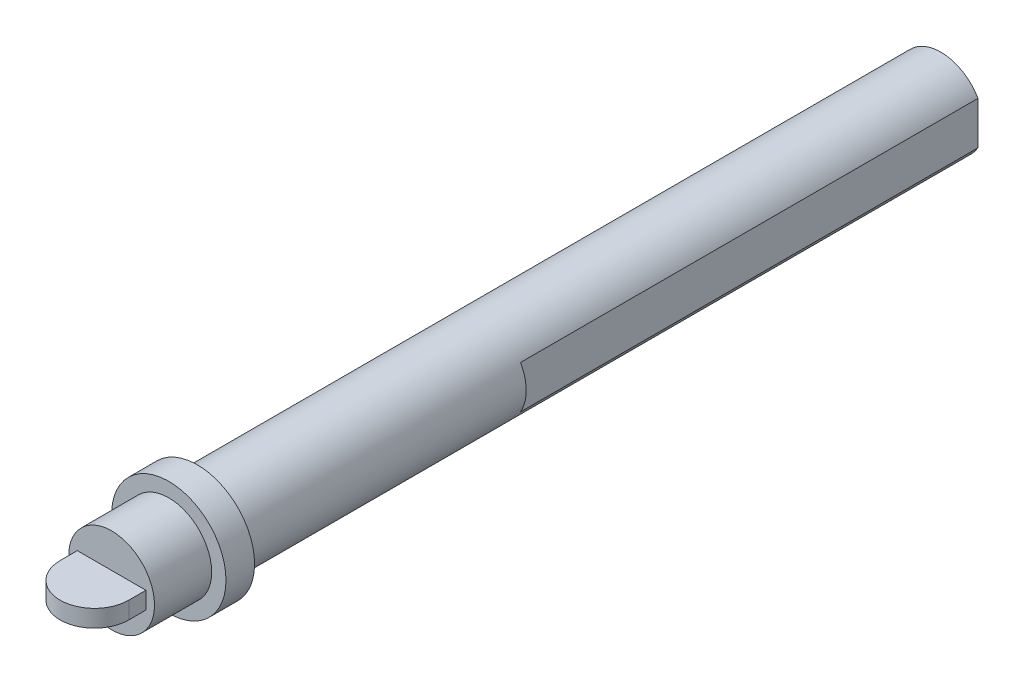
ISO-10303-21;
HEADER;
FILE_DESCRIPTION(('STEP AP214'),'2;1');
FILE_NAME('part.step','',(''),(''),'','','');
FILE_SCHEMA(('AUTOMOTIVE_DESIGN { 1 0 10303 214 1 1 1 1 }'));
ENDSEC;
DATA;
#1=APPLICATION_CONTEXT('core data for automotive mechanical design processes');
#2=APPLICATION_PROTOCOL_DEFINITION('international standard','automotive_design',2000,#1);
#3=PRODUCT_CONTEXT('',#1,'mechanical');
#4=PRODUCT('Part','Part','',(#3));
#5=PRODUCT_RELATED_PRODUCT_CATEGORY('part','',(#4));
#6=PRODUCT_DEFINITION_FORMATION('','',#4);
#7=PRODUCT_DEFINITION_CONTEXT('part definition',#1,'design');
#8=PRODUCT_DEFINITION('design','',#6,#7);
#9=PRODUCT_DEFINITION_SHAPE('','',#8);
#10=(LENGTH_UNIT() NAMED_UNIT(*) SI_UNIT(.MILLI.,.METRE.));
#11=(NAMED_UNIT(*) PLANE_ANGLE_UNIT() SI_UNIT($,.RADIAN.));
#12=(NAMED_UNIT(*) SI_UNIT($,.STERADIAN.) SOLID_ANGLE_UNIT());
#13=UNCERTAINTY_MEASURE_WITH_UNIT(LENGTH_MEASURE(1.E-05),#10,'distance_accuracy_value','');
#14=(GEOMETRIC_REPRESENTATION_CONTEXT(3) GLOBAL_UNCERTAINTY_ASSIGNED_CONTEXT((#13)) GLOBAL_UNIT_ASSIGNED_CONTEXT((#10,
#11,#12)) REPRESENTATION_CONTEXT('',''));
#15=CARTESIAN_POINT('',(0.,0.,0.));
#16=DIRECTION('',(0.,0.,1.));
#17=DIRECTION('',(1.,0.,0.));
#18=AXIS2_PLACEMENT_3D('',#15,#16,#17);
#19=CARTESIAN_POINT('',(0.,0.,15.));
#20=DIRECTION('',(0.,0.,1.));
#21=DIRECTION('',(1.,0.,0.));
#22=AXIS2_PLACEMENT_3D('',#19,#20,#21);
#23=PLANE('',#22);
#24=CARTESIAN_POINT('',(0.,0.,15.));
#25=DIRECTION('',(0.,0.,1.));
#26=DIRECTION('',(1.,0.,0.));
#27=AXIS2_PLACEMENT_3D('',#24,#25,#26);
#28=CIRCLE('',#27,7.5);
#29=CARTESIAN_POINT('',(7.5,0.,15.));
#30=VERTEX_POINT('',#29);
#31=EDGE_CURVE('E169',#30,#30,#28,.T.);
#32=ORIENTED_EDGE('',*,*,#31,.T.);
#33=EDGE_LOOP('',(#32));
#34=FACE_BOUND('',#33,.T.);
#35=DIRECTION('',(0.,-1.,0.));
#36=VECTOR('',#35,1.);
#37=CARTESIAN_POINT('',(6.,1.5,15.));
#38=LINE('',#37,#36);
#39=CARTESIAN_POINT('',(6.,1.5,15.));
#40=VERTEX_POINT('',#39);
#41=CARTESIAN_POINT('',(6.,-1.5,15.));
#42=VERTEX_POINT('',#41);
#43=EDGE_CURVE('E123',#40,#42,#38,.T.);
#44=ORIENTED_EDGE('',*,*,#43,.T.);
#45=DIRECTION('',(-1.,0.,0.));
#46=VECTOR('',#45,1.);
#47=CARTESIAN_POINT('',(-6.,-1.5,15.));
#48=LINE('',#47,#46);
#49=CARTESIAN_POINT('',(-6.,-1.5,15.));
#50=VERTEX_POINT('',#49);
#51=EDGE_CURVE('E61',#42,#50,#48,.T.);
#52=ORIENTED_EDGE('',*,*,#51,.T.);
#53=DIRECTION('',(0.,-1.,0.));
#54=VECTOR('',#53,1.);
#55=CARTESIAN_POINT('',(-6.,1.5,15.));
#56=LINE('',#55,#54);
#57=CARTESIAN_POINT('',(-6.,1.5,15.));
#58=VERTEX_POINT('',#57);
#59=EDGE_CURVE('E150',#58,#50,#56,.T.);
#60=ORIENTED_EDGE('',*,*,#59,.F.);
#61=DIRECTION('',(-1.,0.,0.));
#62=VECTOR('',#61,1.);
#63=CARTESIAN_POINT('',(-6.,1.5,15.));
#64=LINE('',#63,#62);
#65=EDGE_CURVE('E127',#40,#58,#64,.T.);
#66=ORIENTED_EDGE('',*,*,#65,.F.);
#67=EDGE_LOOP('',(#44,#52,#60,#66));
#68=FACE_BOUND('',#67,.T.);
#69=ADVANCED_FACE('F43',(#34,#68),#23,.T.);
#70=CARTESIAN_POINT('',(0.,0.,-130.));
#71=DIRECTION('',(0.,0.,1.));
#72=DIRECTION('',(1.,0.,0.));
#73=AXIS2_PLACEMENT_3D('',#70,#71,#72);
#74=CYLINDRICAL_SURFACE('',#73,7.5);
#75=DIRECTION('',(0.,0.,-1.));
#76=VECTOR('',#75,1.);
#77=CARTESIAN_POINT('',(6.5,-3.74165738677394,-50.));
#78=LINE('',#77,#76);
#79=CARTESIAN_POINT('',(6.5,-3.74165738677394,-50.));
#80=VERTEX_POINT('',#79);
#81=CARTESIAN_POINT('',(6.5,-3.74165738677394,-130.));
#82=VERTEX_POINT('',#81);
#83=EDGE_CURVE('E69',#80,#82,#78,.T.);
#84=ORIENTED_EDGE('',*,*,#83,.F.);
#85=CARTESIAN_POINT('',(0.,0.,-50.));
#86=DIRECTION('',(0.,0.,-1.));
#87=DIRECTION('',(-1.,0.,0.));
#88=AXIS2_PLACEMENT_3D('',#85,#86,#87);
#89=CIRCLE('',#88,7.5);
#90=CARTESIAN_POINT('',(6.5,3.74165738677394,-50.));
#91=VERTEX_POINT('',#90);
#92=EDGE_CURVE('E154',#91,#80,#89,.T.);
#93=ORIENTED_EDGE('',*,*,#92,.F.);
#94=DIRECTION('',(0.,0.,-1.));
#95=VECTOR('',#94,1.);
#96=CARTESIAN_POINT('',(6.5,3.74165738677394,-50.));
#97=LINE('',#96,#95);
#98=CARTESIAN_POINT('',(6.5,3.74165738677394,-130.));
#99=VERTEX_POINT('',#98);
#100=EDGE_CURVE('E165',#91,#99,#97,.T.);
#101=ORIENTED_EDGE('',*,*,#100,.T.);
#102=CARTESIAN_POINT('',(0.,0.,-130.));
#103=DIRECTION('',(0.,0.,1.));
#104=DIRECTION('',(1.,0.,0.));
#105=AXIS2_PLACEMENT_3D('',#102,#103,#104);
#106=CIRCLE('',#105,7.5);
#107=CARTESIAN_POINT('',(-6.5,3.74165738677394,-130.));
#108=VERTEX_POINT('',#107);
#109=EDGE_CURVE('E53',#99,#108,#106,.T.);
#110=ORIENTED_EDGE('',*,*,#109,.T.);
#111=DIRECTION('',(0.,0.,-1.));
#112=VECTOR('',#111,1.);
#113=CARTESIAN_POINT('',(-6.5,3.74165738677394,-50.));
#114=LINE('',#113,#112);
#115=CARTESIAN_POINT('',(-6.5,3.74165738677394,-50.));
#116=VERTEX_POINT('',#115);
#117=EDGE_CURVE('E177',#116,#108,#114,.T.);
#118=ORIENTED_EDGE('',*,*,#117,.F.);
#119=CARTESIAN_POINT('',(0.,0.,-50.));
#120=DIRECTION('',(0.,0.,-1.));
#121=DIRECTION('',(-1.,0.,0.));
#122=AXIS2_PLACEMENT_3D('',#119,#120,#121);
#123=CIRCLE('',#122,7.5);
#124=CARTESIAN_POINT('',(-6.5,-3.74165738677394,-50.));
#125=VERTEX_POINT('',#124);
#126=EDGE_CURVE('E148',#125,#116,#123,.T.);
#127=ORIENTED_EDGE('',*,*,#126,.F.);
#128=DIRECTION('',(0.,0.,-1.));
#129=VECTOR('',#128,1.);
#130=CARTESIAN_POINT('',(-6.5,-3.74165738677394,-50.));
#131=LINE('',#130,#129);
#132=CARTESIAN_POINT('',(-6.5,-3.74165738677394,-130.));
#133=VERTEX_POINT('',#132);
#134=EDGE_CURVE('E164',#125,#133,#131,.T.);
#135=ORIENTED_EDGE('',*,*,#134,.T.);
#136=EDGE_CURVE('E196',#133,#82,#106,.T.);
#137=ORIENTED_EDGE('',*,*,#136,.T.);
#138=EDGE_LOOP('',(#84,#93,#101,#110,#118,#127,#135,#137));
#139=FACE_BOUND('',#138,.T.);
#140=CARTESIAN_POINT('',(0.,0.,0.));
#141=DIRECTION('',(0.,0.,1.));
#142=DIRECTION('',(1.,0.,0.));
#143=AXIS2_PLACEMENT_3D('',#140,#141,#142);
#144=CIRCLE('',#143,7.5);
#145=CARTESIAN_POINT('',(7.5,0.,0.));
#146=VERTEX_POINT('',#145);
#147=EDGE_CURVE('E47',#146,#146,#144,.T.);
#148=ORIENTED_EDGE('',*,*,#147,.F.);
#149=EDGE_LOOP('',(#148));
#150=FACE_BOUND('',#149,.T.);
#151=ADVANCED_FACE('F45',(#139,#150),#74,.T.);
#152=CARTESIAN_POINT('',(0.,0.,-130.));
#153=DIRECTION('',(0.,0.,1.));
#154=DIRECTION('',(1.,0.,0.));
#155=AXIS2_PLACEMENT_3D('',#152,#153,#154);
#156=PLANE('',#155);
#157=ORIENTED_EDGE('',*,*,#109,.F.);
#158=DIRECTION('',(0.,1.,0.));
#159=VECTOR('',#158,1.);
#160=CARTESIAN_POINT('',(6.5,3.74165738677394,-130.));
#161=LINE('',#160,#159);
#162=EDGE_CURVE('E158',#82,#99,#161,.T.);
#163=ORIENTED_EDGE('',*,*,#162,.F.);
#164=ORIENTED_EDGE('',*,*,#136,.F.);
#165=DIRECTION('',(0.,-1.,0.));
#166=VECTOR('',#165,1.);
#167=CARTESIAN_POINT('',(-6.5,3.74165738677394,-130.));
#168=LINE('',#167,#166);
#169=EDGE_CURVE('E144',#108,#133,#168,.T.);
#170=ORIENTED_EDGE('',*,*,#169,.F.);
#171=EDGE_LOOP('',(#157,#163,#164,#170));
#172=FACE_BOUND('',#171,.T.);
#173=ADVANCED_FACE('F211',(#172),#156,.F.);
#174=CARTESIAN_POINT('',(0.,0.,5.));
#175=DIRECTION('',(0.,0.,-1.));
#176=DIRECTION('',(-1.,0.,0.));
#177=AXIS2_PLACEMENT_3D('',#174,#175,#176);
#178=CYLINDRICAL_SURFACE('',#177,10.);
#179=CARTESIAN_POINT('',(0.,0.,5.));
#180=DIRECTION('',(0.,0.,1.));
#181=DIRECTION('',(1.,0.,0.));
#182=AXIS2_PLACEMENT_3D('',#179,#180,#181);
#183=CIRCLE('',#182,10.);
#184=CARTESIAN_POINT('',(10.,0.,5.));
#185=VERTEX_POINT('',#184);
#186=EDGE_CURVE('E188',#185,#185,#183,.T.);
#187=ORIENTED_EDGE('',*,*,#186,.F.);
#188=EDGE_LOOP('',(#187));
#189=FACE_BOUND('',#188,.T.);
#190=CARTESIAN_POINT('',(0.,0.,0.));
#191=DIRECTION('',(0.,0.,1.));
#192=DIRECTION('',(1.,0.,0.));
#193=AXIS2_PLACEMENT_3D('',#190,#191,#192);
#194=CIRCLE('',#193,10.);
#195=CARTESIAN_POINT('',(10.,0.,0.));
#196=VERTEX_POINT('',#195);
#197=EDGE_CURVE('E186',#196,#196,#194,.T.);
#198=ORIENTED_EDGE('',*,*,#197,.T.);
#199=EDGE_LOOP('',(#198));
#200=FACE_BOUND('',#199,.T.);
#201=ADVANCED_FACE('F216',(#189,#200),#178,.T.);
#202=CARTESIAN_POINT('',(0.,0.,5.));
#203=DIRECTION('',(0.,0.,1.));
#204=DIRECTION('',(1.,0.,0.));
#205=AXIS2_PLACEMENT_3D('',#202,#203,#204);
#206=PLANE('',#205);
#207=CARTESIAN_POINT('',(0.,0.,5.));
#208=DIRECTION('',(0.,0.,1.));
#209=DIRECTION('',(1.,0.,0.));
#210=AXIS2_PLACEMENT_3D('',#207,#208,#209);
#211=CIRCLE('',#210,7.5);
#212=CARTESIAN_POINT('',(7.5,0.,5.));
#213=VERTEX_POINT('',#212);
#214=EDGE_CURVE('E11',#213,#213,#211,.T.);
#215=ORIENTED_EDGE('',*,*,#214,.F.);
#216=EDGE_LOOP('',(#215));
#217=FACE_BOUND('',#216,.T.);
#218=ORIENTED_EDGE('',*,*,#186,.T.);
#219=EDGE_LOOP('',(#218));
#220=FACE_BOUND('',#219,.T.);
#221=ADVANCED_FACE('F245',(#217,#220),#206,.T.);
#222=CARTESIAN_POINT('',(0.,0.,0.));
#223=DIRECTION('',(0.,0.,1.));
#224=DIRECTION('',(1.,0.,0.));
#225=AXIS2_PLACEMENT_3D('',#222,#223,#224);
#226=PLANE('',#225);
#227=ORIENTED_EDGE('',*,*,#147,.T.);
#228=EDGE_LOOP('',(#227));
#229=FACE_BOUND('',#228,.T.);
#230=ORIENTED_EDGE('',*,*,#197,.F.);
#231=EDGE_LOOP('',(#230));
#232=FACE_BOUND('',#231,.T.);
#233=ADVANCED_FACE('F207',(#229,#232),#226,.F.);
#234=CARTESIAN_POINT('',(0.,0.,15.));
#235=DIRECTION('',(0.,0.,-1.));
#236=DIRECTION('',(-1.,0.,0.));
#237=AXIS2_PLACEMENT_3D('',#234,#235,#236);
#238=CYLINDRICAL_SURFACE('',#237,7.5);
#239=ORIENTED_EDGE('',*,*,#31,.F.);
#240=EDGE_LOOP('',(#239));
#241=FACE_BOUND('',#240,.T.);
#242=ORIENTED_EDGE('',*,*,#214,.T.);
#243=EDGE_LOOP('',(#242));
#244=FACE_BOUND('',#243,.T.);
#245=ADVANCED_FACE('F238',(#241,#244),#238,.T.);
#246=CARTESIAN_POINT('',(-6.5,3.74165738677394,-50.));
#247=DIRECTION('',(1.,0.,0.));
#248=DIRECTION('',(0.,0.,-1.));
#249=AXIS2_PLACEMENT_3D('',#246,#247,#248);
#250=PLANE('',#249);
#251=ORIENTED_EDGE('',*,*,#169,.T.);
#252=ORIENTED_EDGE('',*,*,#134,.F.);
#253=DIRECTION('',(0.,-1.,0.));
#254=VECTOR('',#253,1.);
#255=CARTESIAN_POINT('',(-6.5,3.74165738677394,-50.));
#256=LINE('',#255,#254);
#257=EDGE_CURVE('E174',#116,#125,#256,.T.);
#258=ORIENTED_EDGE('',*,*,#257,.F.);
#259=ORIENTED_EDGE('',*,*,#117,.T.);
#260=EDGE_LOOP('',(#251,#252,#258,#259));
#261=FACE_BOUND('',#260,.T.);
#262=ADVANCED_FACE('F226',(#261),#250,.F.);
#263=CARTESIAN_POINT('',(0.,0.,-50.));
#264=DIRECTION('',(0.,0.,-1.));
#265=DIRECTION('',(-1.,0.,0.));
#266=AXIS2_PLACEMENT_3D('',#263,#264,#265);
#267=PLANE('',#266);
#268=ORIENTED_EDGE('',*,*,#126,.T.);
#269=ORIENTED_EDGE('',*,*,#257,.T.);
#270=EDGE_LOOP('',(#268,#269));
#271=FACE_BOUND('',#270,.T.);
#272=ADVANCED_FACE('F230',(#271),#267,.T.);
#273=CARTESIAN_POINT('',(6.5,3.74165738677394,-50.));
#274=DIRECTION('',(-1.,0.,0.));
#275=DIRECTION('',(0.,0.,1.));
#276=AXIS2_PLACEMENT_3D('',#273,#274,#275);
#277=PLANE('',#276);
#278=ORIENTED_EDGE('',*,*,#162,.T.);
#279=ORIENTED_EDGE('',*,*,#100,.F.);
#280=DIRECTION('',(0.,1.,0.));
#281=VECTOR('',#280,1.);
#282=CARTESIAN_POINT('',(6.5,3.74165738677394,-50.));
#283=LINE('',#282,#281);
#284=EDGE_CURVE('E157',#80,#91,#283,.T.);
#285=ORIENTED_EDGE('',*,*,#284,.F.);
#286=ORIENTED_EDGE('',*,*,#83,.T.);
#287=EDGE_LOOP('',(#278,#279,#285,#286));
#288=FACE_BOUND('',#287,.T.);
#289=ADVANCED_FACE('F223',(#288),#277,.F.);
#290=CARTESIAN_POINT('',(0.,0.,-50.));
#291=DIRECTION('',(0.,0.,-1.));
#292=DIRECTION('',(-1.,0.,0.));
#293=AXIS2_PLACEMENT_3D('',#290,#291,#292);
#294=PLANE('',#293);
#295=ORIENTED_EDGE('',*,*,#92,.T.);
#296=ORIENTED_EDGE('',*,*,#284,.T.);
#297=EDGE_LOOP('',(#295,#296));
#298=FACE_BOUND('',#297,.T.);
#299=ADVANCED_FACE('F222',(#298),#294,.T.);
#300=CARTESIAN_POINT('',(0.,1.5,18.));
#301=DIRECTION('',(0.,-1.,0.));
#302=DIRECTION('',(0.,0.,-1.));
#303=AXIS2_PLACEMENT_3D('',#300,#301,#302);
#304=CYLINDRICAL_SURFACE('',#303,6.);
#305=CARTESIAN_POINT('',(0.,-1.5,18.));
#306=DIRECTION('',(0.,1.,0.));
#307=DIRECTION('',(0.,0.,1.));
#308=AXIS2_PLACEMENT_3D('',#305,#306,#307);
#309=CIRCLE('',#308,6.);
#310=CARTESIAN_POINT('',(-6.,-1.5,18.));
#311=VERTEX_POINT('',#310);
#312=CARTESIAN_POINT('',(6.,-1.5,18.));
#313=VERTEX_POINT('',#312);
#314=EDGE_CURVE('E142',#311,#313,#309,.T.);
#315=ORIENTED_EDGE('',*,*,#314,.T.);
#316=DIRECTION('',(0.,-1.,0.));
#317=VECTOR('',#316,1.);
#318=CARTESIAN_POINT('',(6.,1.5,18.));
#319=LINE('',#318,#317);
#320=CARTESIAN_POINT('',(6.,1.5,18.));
#321=VERTEX_POINT('',#320);
#322=EDGE_CURVE('E120',#321,#313,#319,.T.);
#323=ORIENTED_EDGE('',*,*,#322,.F.);
#324=CARTESIAN_POINT('',(0.,1.5,18.));
#325=DIRECTION('',(0.,1.,0.));
#326=DIRECTION('',(0.,0.,1.));
#327=AXIS2_PLACEMENT_3D('',#324,#325,#326);
#328=CIRCLE('',#327,6.);
#329=CARTESIAN_POINT('',(-6.,1.5,18.));
#330=VERTEX_POINT('',#329);
#331=EDGE_CURVE('E128',#330,#321,#328,.T.);
#332=ORIENTED_EDGE('',*,*,#331,.F.);
#333=DIRECTION('',(0.,-1.,0.));
#334=VECTOR('',#333,1.);
#335=CARTESIAN_POINT('',(-6.,1.5,18.));
#336=LINE('',#335,#334);
#337=EDGE_CURVE('E381',#330,#311,#336,.T.);
#338=ORIENTED_EDGE('',*,*,#337,.T.);
#339=EDGE_LOOP('',(#315,#323,#332,#338));
#340=FACE_BOUND('',#339,.T.);
#341=ADVANCED_FACE('F140',(#340),#304,.T.);
#342=CARTESIAN_POINT('',(6.,1.5,18.));
#343=DIRECTION('',(-1.,0.,0.));
#344=DIRECTION('',(0.,0.,1.));
#345=AXIS2_PLACEMENT_3D('',#342,#343,#344);
#346=PLANE('',#345);
#347=DIRECTION('',(0.,0.,-1.));
#348=VECTOR('',#347,1.);
#349=CARTESIAN_POINT('',(6.,-1.5,18.));
#350=LINE('',#349,#348);
#351=EDGE_CURVE('E369',#313,#42,#350,.T.);
#352=ORIENTED_EDGE('',*,*,#351,.T.);
#353=ORIENTED_EDGE('',*,*,#43,.F.);
#354=DIRECTION('',(0.,0.,-1.));
#355=VECTOR('',#354,1.);
#356=CARTESIAN_POINT('',(6.,1.5,18.));
#357=LINE('',#356,#355);
#358=EDGE_CURVE('E116',#321,#40,#357,.T.);
#359=ORIENTED_EDGE('',*,*,#358,.F.);
#360=ORIENTED_EDGE('',*,*,#322,.T.);
#361=EDGE_LOOP('',(#352,#353,#359,#360));
#362=FACE_BOUND('',#361,.T.);
#363=ADVANCED_FACE('F118',(#362),#346,.F.);
#364=CARTESIAN_POINT('',(-6.,1.5,18.));
#365=DIRECTION('',(1.,0.,0.));
#366=DIRECTION('',(0.,0.,-1.));
#367=AXIS2_PLACEMENT_3D('',#364,#365,#366);
#368=PLANE('',#367);
#369=DIRECTION('',(0.,0.,1.));
#370=VECTOR('',#369,1.);
#371=CARTESIAN_POINT('',(-6.,-1.5,18.));
#372=LINE('',#371,#370);
#373=EDGE_CURVE('E138',#50,#311,#372,.T.);
#374=ORIENTED_EDGE('',*,*,#373,.T.);
#375=ORIENTED_EDGE('',*,*,#337,.F.);
#376=DIRECTION('',(0.,0.,1.));
#377=VECTOR('',#376,1.);
#378=CARTESIAN_POINT('',(-6.,1.5,18.));
#379=LINE('',#378,#377);
#380=EDGE_CURVE('E133',#58,#330,#379,.T.);
#381=ORIENTED_EDGE('',*,*,#380,.F.);
#382=ORIENTED_EDGE('',*,*,#59,.T.);
#383=EDGE_LOOP('',(#374,#375,#381,#382));
#384=FACE_BOUND('',#383,.T.);
#385=ADVANCED_FACE('F337',(#384),#368,.F.);
#386=CARTESIAN_POINT('',(0.,1.5,18.));
#387=DIRECTION('',(0.,1.,0.));
#388=DIRECTION('',(0.,0.,1.));
#389=AXIS2_PLACEMENT_3D('',#386,#387,#388);
#390=PLANE('',#389);
#391=ORIENTED_EDGE('',*,*,#331,.T.);
#392=ORIENTED_EDGE('',*,*,#358,.T.);
#393=ORIENTED_EDGE('',*,*,#65,.T.);
#394=ORIENTED_EDGE('',*,*,#380,.T.);
#395=EDGE_LOOP('',(#391,#392,#393,#394));
#396=FACE_BOUND('',#395,.T.);
#397=ADVANCED_FACE('F131',(#396),#390,.T.);
#398=CARTESIAN_POINT('',(0.,-1.5,18.));
#399=DIRECTION('',(0.,1.,0.));
#400=DIRECTION('',(0.,0.,1.));
#401=AXIS2_PLACEMENT_3D('',#398,#399,#400);
#402=PLANE('',#401);
#403=ORIENTED_EDGE('',*,*,#314,.F.);
#404=ORIENTED_EDGE('',*,*,#373,.F.);
#405=ORIENTED_EDGE('',*,*,#51,.F.);
#406=ORIENTED_EDGE('',*,*,#351,.F.);
#407=EDGE_LOOP('',(#403,#404,#405,#406));
#408=FACE_BOUND('',#407,.T.);
#409=ADVANCED_FACE('F353',(#408),#402,.F.);
#410=CLOSED_SHELL('',(#69,#151,#173,#201,#221,#233,#245,#262,#272,#289,#299,#341,#363,#385,#397,#409));
#411=MANIFOLD_SOLID_BREP('B2',#410);
#412=ADVANCED_BREP_SHAPE_REPRESENTATION('',(#18,#411),#14);
#413=SHAPE_DEFINITION_REPRESENTATION(#9,#412);
ENDSEC;
END-ISO-10303-21;
